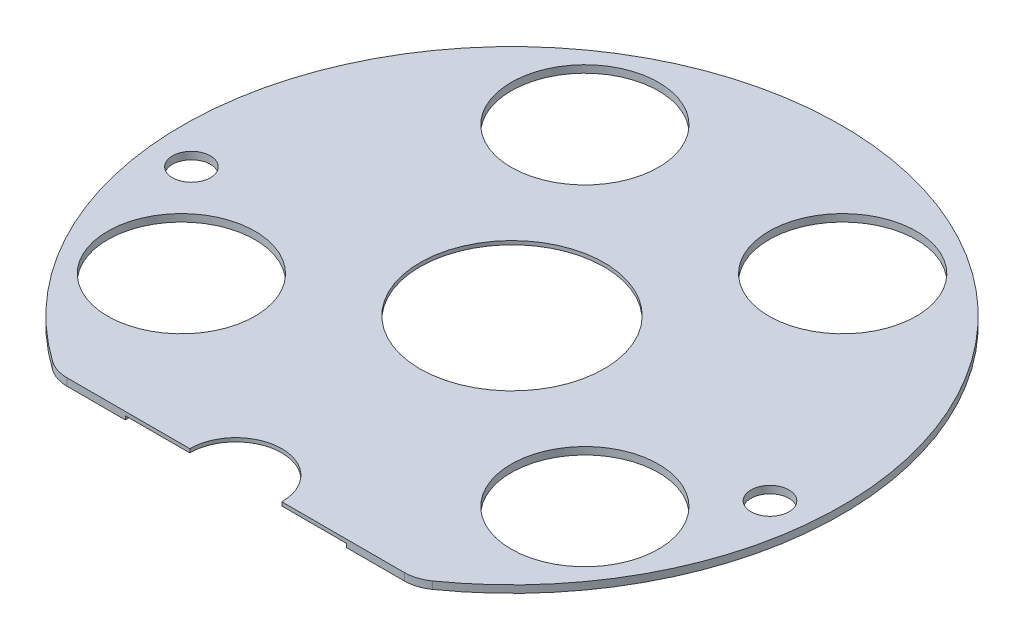
ISO-10303-21;
HEADER;
FILE_DESCRIPTION(('STEP AP214'),'2;1');
FILE_NAME('part.step','',(''),(''),'','','');
FILE_SCHEMA(('AUTOMOTIVE_DESIGN { 1 0 10303 214 1 1 1 1 }'));
ENDSEC;
DATA;
#1=APPLICATION_CONTEXT('core data for automotive mechanical design processes');
#2=APPLICATION_PROTOCOL_DEFINITION('international standard','automotive_design',2000,#1);
#3=PRODUCT_CONTEXT('',#1,'mechanical');
#4=PRODUCT('Part','Part','',(#3));
#5=PRODUCT_RELATED_PRODUCT_CATEGORY('part','',(#4));
#6=PRODUCT_DEFINITION_FORMATION('','',#4);
#7=PRODUCT_DEFINITION_CONTEXT('part definition',#1,'design');
#8=PRODUCT_DEFINITION('design','',#6,#7);
#9=PRODUCT_DEFINITION_SHAPE('','',#8);
#10=(LENGTH_UNIT() NAMED_UNIT(*) SI_UNIT(.MILLI.,.METRE.));
#11=(NAMED_UNIT(*) PLANE_ANGLE_UNIT() SI_UNIT($,.RADIAN.));
#12=(NAMED_UNIT(*) SI_UNIT($,.STERADIAN.) SOLID_ANGLE_UNIT());
#13=UNCERTAINTY_MEASURE_WITH_UNIT(LENGTH_MEASURE(1.E-05),#10,'distance_accuracy_value','');
#14=(GEOMETRIC_REPRESENTATION_CONTEXT(3) GLOBAL_UNCERTAINTY_ASSIGNED_CONTEXT((#13)) GLOBAL_UNIT_ASSIGNED_CONTEXT((#10,
#11,#12)) REPRESENTATION_CONTEXT('',''));
#15=CARTESIAN_POINT('',(0.,0.,0.));
#16=DIRECTION('',(0.,0.,1.));
#17=DIRECTION('',(1.,0.,0.));
#18=AXIS2_PLACEMENT_3D('',#15,#16,#17);
#19=CARTESIAN_POINT('',(-48.8390212842149,-2.,75.));
#20=DIRECTION('',(0.,0.,1.));
#21=DIRECTION('',(1.,0.,0.));
#22=AXIS2_PLACEMENT_3D('',#19,#20,#21);
#23=PLANE('',#22);
#24=DIRECTION('',(0.,1.,0.));
#25=VECTOR('',#24,1.);
#26=CARTESIAN_POINT('',(12.5,-20.,75.));
#27=LINE('',#26,#25);
#28=CARTESIAN_POINT('',(12.5,-1.,75.));
#29=VERTEX_POINT('',#28);
#30=CARTESIAN_POINT('',(12.5,0.,75.));
#31=VERTEX_POINT('',#30);
#32=EDGE_CURVE('E166',#29,#31,#27,.T.);
#33=ORIENTED_EDGE('',*,*,#32,.F.);
#34=DIRECTION('',(-1.,0.,0.));
#35=VECTOR('',#34,1.);
#36=CARTESIAN_POINT('',(-30.,-1.,75.));
#37=LINE('',#36,#35);
#38=CARTESIAN_POINT('',(30.,-1.,75.));
#39=VERTEX_POINT('',#38);
#40=EDGE_CURVE('E301',#39,#29,#37,.T.);
#41=ORIENTED_EDGE('',*,*,#40,.F.);
#42=DIRECTION('',(0.,-1.,0.));
#43=VECTOR('',#42,1.);
#44=CARTESIAN_POINT('',(30.,-1.,75.));
#45=LINE('',#44,#43);
#46=CARTESIAN_POINT('',(30.,-2.,75.));
#47=VERTEX_POINT('',#46);
#48=EDGE_CURVE('E316',#39,#47,#45,.T.);
#49=ORIENTED_EDGE('',*,*,#48,.T.);
#50=DIRECTION('',(1.,0.,0.));
#51=VECTOR('',#50,1.);
#52=CARTESIAN_POINT('',(-48.8390212842149,-2.,75.));
#53=LINE('',#52,#51);
#54=CARTESIAN_POINT('',(45.7739008606433,-2.,75.));
#55=VERTEX_POINT('',#54);
#56=EDGE_CURVE('E464',#47,#55,#53,.T.);
#57=ORIENTED_EDGE('',*,*,#56,.T.);
#58=DIRECTION('',(0.,1.,0.));
#59=VECTOR('',#58,1.);
#60=CARTESIAN_POINT('',(45.7739008606433,-2.,75.));
#61=LINE('',#60,#59);
#62=CARTESIAN_POINT('',(45.7739008606433,0.,75.));
#63=VERTEX_POINT('',#62);
#64=EDGE_CURVE('E190',#55,#63,#61,.T.);
#65=ORIENTED_EDGE('',*,*,#64,.T.);
#66=DIRECTION('',(1.,0.,0.));
#67=VECTOR('',#66,1.);
#68=CARTESIAN_POINT('',(-48.8390212842149,0.,75.));
#69=LINE('',#68,#67);
#70=EDGE_CURVE('E181',#31,#63,#69,.T.);
#71=ORIENTED_EDGE('',*,*,#70,.F.);
#72=EDGE_LOOP('',(#33,#41,#49,#57,#65,#71));
#73=FACE_BOUND('',#72,.T.);
#74=ADVANCED_FACE('F40',(#73),#23,.T.);
#75=CARTESIAN_POINT('',(0.,-2.00000000000001,0.));
#76=DIRECTION('',(0.,1.,0.));
#77=DIRECTION('',(0.,0.,1.));
#78=AXIS2_PLACEMENT_3D('',#75,#76,#77);
#79=CYLINDRICAL_SURFACE('',#78,25.);
#80=CARTESIAN_POINT('',(0.,0.,0.));
#81=DIRECTION('',(0.,1.,0.));
#82=DIRECTION('',(0.,0.,1.));
#83=AXIS2_PLACEMENT_3D('',#80,#81,#82);
#84=CIRCLE('',#83,25.);
#85=CARTESIAN_POINT('',(0.,0.,25.));
#86=VERTEX_POINT('',#85);
#87=EDGE_CURVE('E416',#86,#86,#84,.T.);
#88=ORIENTED_EDGE('',*,*,#87,.T.);
#89=EDGE_LOOP('',(#88));
#90=FACE_BOUND('',#89,.T.);
#91=CARTESIAN_POINT('',(0.,-1.,0.));
#92=DIRECTION('',(0.,-1.,0.));
#93=DIRECTION('',(0.,0.,-1.));
#94=AXIS2_PLACEMENT_3D('',#91,#92,#93);
#95=CIRCLE('',#94,25.);
#96=CARTESIAN_POINT('',(0.,-1.,-25.));
#97=VERTEX_POINT('',#96);
#98=EDGE_CURVE('E228',#97,#97,#95,.F.);
#99=ORIENTED_EDGE('',*,*,#98,.F.);
#100=EDGE_LOOP('',(#99));
#101=FACE_BOUND('',#100,.T.);
#102=ADVANCED_FACE('F263',(#90,#101),#79,.F.);
#103=CARTESIAN_POINT('',(0.,-2.,0.));
#104=DIRECTION('',(0.,1.,0.));
#105=DIRECTION('',(0.,0.,1.));
#106=AXIS2_PLACEMENT_3D('',#103,#104,#105);
#107=PLANE('',#106);
#108=DIRECTION('',(-1.,0.,0.));
#109=VECTOR('',#108,1.);
#110=CARTESIAN_POINT('',(66.05,-2.,-45.));
#111=LINE('',#110,#109);
#112=CARTESIAN_POINT('',(66.05,-2.,-45.));
#113=VERTEX_POINT('',#112);
#114=CARTESIAN_POINT('',(63.95,-2.,-45.));
#115=VERTEX_POINT('',#114);
#116=EDGE_CURVE('E380',#113,#115,#111,.T.);
#117=ORIENTED_EDGE('',*,*,#116,.T.);
#118=DIRECTION('',(0.,0.,1.));
#119=VECTOR('',#118,1.);
#120=CARTESIAN_POINT('',(63.95,-2.,-45.));
#121=LINE('',#120,#119);
#122=CARTESIAN_POINT('',(63.95,-2.,4.99999999999999));
#123=VERTEX_POINT('',#122);
#124=EDGE_CURVE('E398',#115,#123,#121,.T.);
#125=ORIENTED_EDGE('',*,*,#124,.T.);
#126=DIRECTION('',(-1.,0.,0.));
#127=VECTOR('',#126,1.);
#128=CARTESIAN_POINT('',(66.05,-2.,4.99999999999999));
#129=LINE('',#128,#127);
#130=CARTESIAN_POINT('',(66.05,-2.,4.99999999999999));
#131=VERTEX_POINT('',#130);
#132=EDGE_CURVE('E373',#131,#123,#129,.T.);
#133=ORIENTED_EDGE('',*,*,#132,.F.);
#134=DIRECTION('',(0.,0.,1.));
#135=VECTOR('',#134,1.);
#136=CARTESIAN_POINT('',(66.05,-2.,-45.));
#137=LINE('',#136,#135);
#138=EDGE_CURVE('E403',#113,#131,#137,.T.);
#139=ORIENTED_EDGE('',*,*,#138,.F.);
#140=EDGE_LOOP('',(#117,#125,#133,#139));
#141=FACE_BOUND('',#140,.T.);
#142=CARTESIAN_POINT('',(-35.,-2.00000000000001,-54.7722557505166));
#143=DIRECTION('',(0.,1.,0.));
#144=DIRECTION('',(0.,0.,1.));
#145=AXIS2_PLACEMENT_3D('',#142,#143,#144);
#146=CIRCLE('',#145,20.);
#147=CARTESIAN_POINT('',(-35.,-2.00000000000001,-34.7722557505166));
#148=VERTEX_POINT('',#147);
#149=EDGE_CURVE('E437',#148,#148,#146,.T.);
#150=ORIENTED_EDGE('',*,*,#149,.T.);
#151=EDGE_LOOP('',(#150));
#152=FACE_BOUND('',#151,.T.);
#153=CARTESIAN_POINT('',(35.,-2.00000000000001,-54.7722557505166));
#154=DIRECTION('',(0.,1.,0.));
#155=DIRECTION('',(0.,0.,1.));
#156=AXIS2_PLACEMENT_3D('',#153,#154,#155);
#157=CIRCLE('',#156,20.);
#158=CARTESIAN_POINT('',(35.,-2.00000000000001,-34.7722557505166));
#159=VERTEX_POINT('',#158);
#160=EDGE_CURVE('E429',#159,#159,#157,.T.);
#161=ORIENTED_EDGE('',*,*,#160,.T.);
#162=EDGE_LOOP('',(#161));
#163=FACE_BOUND('',#162,.T.);
#164=CARTESIAN_POINT('',(-54.7722557505166,-2.00000000000001,35.));
#165=DIRECTION('',(0.,1.,0.));
#166=DIRECTION('',(0.,0.,1.));
#167=AXIS2_PLACEMENT_3D('',#164,#165,#166);
#168=CIRCLE('',#167,20.);
#169=CARTESIAN_POINT('',(-54.7722557505166,-2.00000000000001,55.));
#170=VERTEX_POINT('',#169);
#171=EDGE_CURVE('E421',#170,#170,#168,.T.);
#172=ORIENTED_EDGE('',*,*,#171,.T.);
#173=EDGE_LOOP('',(#172));
#174=FACE_BOUND('',#173,.T.);
#175=CARTESIAN_POINT('',(54.7722557505166,-2.00000000000001,35.));
#176=DIRECTION('',(0.,1.,0.));
#177=DIRECTION('',(0.,0.,1.));
#178=AXIS2_PLACEMENT_3D('',#175,#176,#177);
#179=CIRCLE('',#178,20.);
#180=CARTESIAN_POINT('',(54.7722557505166,-2.00000000000001,55.));
#181=VERTEX_POINT('',#180);
#182=EDGE_CURVE('E412',#181,#181,#179,.T.);
#183=ORIENTED_EDGE('',*,*,#182,.T.);
#184=EDGE_LOOP('',(#183));
#185=FACE_BOUND('',#184,.T.);
#186=CARTESIAN_POINT('',(-78.5412092321762,-2.00000000000001,8.50167350275914));
#187=DIRECTION('',(0.,1.,0.));
#188=DIRECTION('',(0.,0.,1.));
#189=AXIS2_PLACEMENT_3D('',#186,#187,#188);
#190=CIRCLE('',#189,5.15);
#191=CARTESIAN_POINT('',(-78.5412092321762,-2.00000000000001,13.6516735027591));
#192=VERTEX_POINT('',#191);
#193=EDGE_CURVE('E198',#192,#192,#190,.T.);
#194=ORIENTED_EDGE('',*,*,#193,.T.);
#195=EDGE_LOOP('',(#194));
#196=FACE_BOUND('',#195,.T.);
#197=CARTESIAN_POINT('',(78.5412092321762,-2.00000000000001,8.50167350275912));
#198=DIRECTION('',(0.,1.,0.));
#199=DIRECTION('',(0.,0.,1.));
#200=AXIS2_PLACEMENT_3D('',#197,#198,#199);
#201=CIRCLE('',#200,5.15);
#202=CARTESIAN_POINT('',(78.5412092321762,-2.00000000000001,13.6516735027591));
#203=VERTEX_POINT('',#202);
#204=EDGE_CURVE('E447',#203,#203,#201,.T.);
#205=ORIENTED_EDGE('',*,*,#204,.T.);
#206=EDGE_LOOP('',(#205));
#207=FACE_BOUND('',#206,.T.);
#208=DIRECTION('',(1.,0.,0.));
#209=VECTOR('',#208,1.);
#210=CARTESIAN_POINT('',(-30.,-2.,-30.));
#211=LINE('',#210,#209);
#212=CARTESIAN_POINT('',(-30.,-2.,-30.));
#213=VERTEX_POINT('',#212);
#214=CARTESIAN_POINT('',(30.,-2.,-30.));
#215=VERTEX_POINT('',#214);
#216=EDGE_CURVE('E308',#213,#215,#211,.T.);
#217=ORIENTED_EDGE('',*,*,#216,.F.);
#218=DIRECTION('',(0.,0.,-1.));
#219=VECTOR('',#218,1.);
#220=CARTESIAN_POINT('',(-30.,-2.,75.));
#221=LINE('',#220,#219);
#222=CARTESIAN_POINT('',(-30.,-2.,75.));
#223=VERTEX_POINT('',#222);
#224=EDGE_CURVE('E175',#223,#213,#221,.T.);
#225=ORIENTED_EDGE('',*,*,#224,.F.);
#226=CARTESIAN_POINT('',(-45.7739008606433,-2.,75.));
#227=VERTEX_POINT('',#226);
#228=EDGE_CURVE('E205',#227,#223,#53,.T.);
#229=ORIENTED_EDGE('',*,*,#228,.F.);
#230=CARTESIAN_POINT('',(-45.7739008606433,-2.,65.));
#231=DIRECTION('',(0.,1.,0.));
#232=DIRECTION('',(0.,0.,1.));
#233=AXIS2_PLACEMENT_3D('',#230,#231,#232);
#234=CIRCLE('',#233,10.);
#235=CARTESIAN_POINT('',(-51.5316242393406,-2.,73.1761006289308));
#236=VERTEX_POINT('',#235);
#237=EDGE_CURVE('E221',#227,#236,#234,.F.);
#238=ORIENTED_EDGE('',*,*,#237,.T.);
#239=CARTESIAN_POINT('',(0.,-2.,0.));
#240=DIRECTION('',(0.,1.,0.));
#241=DIRECTION('',(0.,0.,1.));
#242=AXIS2_PLACEMENT_3D('',#239,#240,#241);
#243=CIRCLE('',#242,89.5);
#244=CARTESIAN_POINT('',(51.5316242393406,-2.,73.1761006289308));
#245=VERTEX_POINT('',#244);
#246=EDGE_CURVE('E196',#245,#236,#243,.T.);
#247=ORIENTED_EDGE('',*,*,#246,.F.);
#248=CARTESIAN_POINT('',(45.7739008606433,-2.,65.));
#249=DIRECTION('',(0.,1.,0.));
#250=DIRECTION('',(0.,0.,1.));
#251=AXIS2_PLACEMENT_3D('',#248,#249,#250);
#252=CIRCLE('',#251,10.);
#253=EDGE_CURVE('E224',#245,#55,#252,.F.);
#254=ORIENTED_EDGE('',*,*,#253,.T.);
#255=ORIENTED_EDGE('',*,*,#56,.F.);
#256=DIRECTION('',(0.,0.,1.));
#257=VECTOR('',#256,1.);
#258=CARTESIAN_POINT('',(30.,-2.,75.));
#259=LINE('',#258,#257);
#260=EDGE_CURVE('E296',#215,#47,#259,.T.);
#261=ORIENTED_EDGE('',*,*,#260,.F.);
#262=EDGE_LOOP('',(#217,#225,#229,#238,#247,#254,#255,#261));
#263=FACE_BOUND('',#262,.T.);
#264=DIRECTION('',(1.,0.,0.));
#265=VECTOR('',#264,1.);
#266=CARTESIAN_POINT('',(-66.05,-2.,-45.));
#267=LINE('',#266,#265);
#268=CARTESIAN_POINT('',(-66.05,-2.,-45.));
#269=VERTEX_POINT('',#268);
#270=CARTESIAN_POINT('',(-63.95,-2.,-45.));
#271=VERTEX_POINT('',#270);
#272=EDGE_CURVE('E329',#269,#271,#267,.T.);
#273=ORIENTED_EDGE('',*,*,#272,.F.);
#274=DIRECTION('',(0.,0.,1.));
#275=VECTOR('',#274,1.);
#276=CARTESIAN_POINT('',(-66.05,-2.,-45.));
#277=LINE('',#276,#275);
#278=CARTESIAN_POINT('',(-66.05,-2.,4.99999999999999));
#279=VERTEX_POINT('',#278);
#280=EDGE_CURVE('E361',#269,#279,#277,.T.);
#281=ORIENTED_EDGE('',*,*,#280,.T.);
#282=DIRECTION('',(1.,0.,0.));
#283=VECTOR('',#282,1.);
#284=CARTESIAN_POINT('',(-66.05,-2.,4.99999999999999));
#285=LINE('',#284,#283);
#286=CARTESIAN_POINT('',(-63.95,-2.,4.99999999999999));
#287=VERTEX_POINT('',#286);
#288=EDGE_CURVE('E343',#279,#287,#285,.T.);
#289=ORIENTED_EDGE('',*,*,#288,.T.);
#290=DIRECTION('',(0.,0.,1.));
#291=VECTOR('',#290,1.);
#292=CARTESIAN_POINT('',(-63.95,-2.,-45.));
#293=LINE('',#292,#291);
#294=EDGE_CURVE('E339',#271,#287,#293,.T.);
#295=ORIENTED_EDGE('',*,*,#294,.F.);
#296=EDGE_LOOP('',(#273,#281,#289,#295));
#297=FACE_BOUND('',#296,.T.);
#298=ADVANCED_FACE('F269',(#141,#152,#163,#174,#185,#196,#207,#263,#297),#107,.F.);
#299=CARTESIAN_POINT('',(0.,-2.,0.));
#300=DIRECTION('',(0.,1.,0.));
#301=DIRECTION('',(0.,0.,1.));
#302=AXIS2_PLACEMENT_3D('',#299,#300,#301);
#303=CYLINDRICAL_SURFACE('',#302,89.5);
#304=CARTESIAN_POINT('',(0.,0.,0.));
#305=DIRECTION('',(0.,1.,0.));
#306=DIRECTION('',(0.,0.,1.));
#307=AXIS2_PLACEMENT_3D('',#304,#305,#306);
#308=CIRCLE('',#307,89.5);
#309=CARTESIAN_POINT('',(51.5316242393406,0.,73.1761006289308));
#310=VERTEX_POINT('',#309);
#311=CARTESIAN_POINT('',(-51.5316242393406,0.,73.1761006289308));
#312=VERTEX_POINT('',#311);
#313=EDGE_CURVE('E192',#310,#312,#308,.T.);
#314=ORIENTED_EDGE('',*,*,#313,.F.);
#315=DIRECTION('',(0.,1.,0.));
#316=VECTOR('',#315,1.);
#317=CARTESIAN_POINT('',(51.5316242393405,-2.,73.1761006289308));
#318=LINE('',#317,#316);
#319=EDGE_CURVE('E218',#310,#245,#318,.F.);
#320=ORIENTED_EDGE('',*,*,#319,.T.);
#321=ORIENTED_EDGE('',*,*,#246,.T.);
#322=DIRECTION('',(0.,1.,0.));
#323=VECTOR('',#322,1.);
#324=CARTESIAN_POINT('',(-51.5316242393405,-2.,73.1761006289308));
#325=LINE('',#324,#323);
#326=EDGE_CURVE('E214',#236,#312,#325,.T.);
#327=ORIENTED_EDGE('',*,*,#326,.T.);
#328=EDGE_LOOP('',(#314,#320,#321,#327));
#329=FACE_BOUND('',#328,.T.);
#330=ADVANCED_FACE('F275',(#329),#303,.T.);
#331=DIRECTION('',(0.,1.,0.));
#332=VECTOR('',#331,1.);
#333=CARTESIAN_POINT('',(-12.5,-20.,75.));
#334=LINE('',#333,#332);
#335=CARTESIAN_POINT('',(-12.5,0.,75.));
#336=VERTEX_POINT('',#335);
#337=CARTESIAN_POINT('',(-12.5,-1.,75.));
#338=VERTEX_POINT('',#337);
#339=EDGE_CURVE('E56',#336,#338,#334,.F.);
#340=ORIENTED_EDGE('',*,*,#339,.F.);
#341=CARTESIAN_POINT('',(-45.7739008606433,0.,75.));
#342=VERTEX_POINT('',#341);
#343=EDGE_CURVE('E184',#342,#336,#69,.T.);
#344=ORIENTED_EDGE('',*,*,#343,.F.);
#345=DIRECTION('',(0.,1.,0.));
#346=VECTOR('',#345,1.);
#347=CARTESIAN_POINT('',(-45.7739008606433,-2.,75.));
#348=LINE('',#347,#346);
#349=EDGE_CURVE('E202',#342,#227,#348,.F.);
#350=ORIENTED_EDGE('',*,*,#349,.T.);
#351=ORIENTED_EDGE('',*,*,#228,.T.);
#352=DIRECTION('',(0.,-1.,0.));
#353=VECTOR('',#352,1.);
#354=CARTESIAN_POINT('',(-30.,-1.,75.));
#355=LINE('',#354,#353);
#356=CARTESIAN_POINT('',(-30.,-1.,75.));
#357=VERTEX_POINT('',#356);
#358=EDGE_CURVE('E233',#357,#223,#355,.T.);
#359=ORIENTED_EDGE('',*,*,#358,.F.);
#360=EDGE_CURVE('E286',#338,#357,#37,.T.);
#361=ORIENTED_EDGE('',*,*,#360,.F.);
#362=EDGE_LOOP('',(#340,#344,#350,#351,#359,#361));
#363=FACE_BOUND('',#362,.T.);
#364=ADVANCED_FACE('F265',(#363),#23,.T.);
#365=CARTESIAN_POINT('',(0.,0.,0.));
#366=DIRECTION('',(0.,1.,0.));
#367=DIRECTION('',(0.,0.,1.));
#368=AXIS2_PLACEMENT_3D('',#365,#366,#367);
#369=PLANE('',#368);
#370=CARTESIAN_POINT('',(0.,0.,75.));
#371=DIRECTION('',(0.,1.,0.));
#372=DIRECTION('',(0.,0.,1.));
#373=AXIS2_PLACEMENT_3D('',#370,#371,#372);
#374=CIRCLE('',#373,12.5);
#375=EDGE_CURVE('E169',#31,#336,#374,.T.);
#376=ORIENTED_EDGE('',*,*,#375,.F.);
#377=ORIENTED_EDGE('',*,*,#70,.T.);
#378=CARTESIAN_POINT('',(45.7739008606433,0.,65.));
#379=DIRECTION('',(0.,1.,0.));
#380=DIRECTION('',(0.,0.,1.));
#381=AXIS2_PLACEMENT_3D('',#378,#379,#380);
#382=CIRCLE('',#381,10.);
#383=EDGE_CURVE('E211',#63,#310,#382,.T.);
#384=ORIENTED_EDGE('',*,*,#383,.T.);
#385=ORIENTED_EDGE('',*,*,#313,.T.);
#386=CARTESIAN_POINT('',(-45.7739008606433,0.,65.));
#387=DIRECTION('',(0.,1.,0.));
#388=DIRECTION('',(0.,0.,1.));
#389=AXIS2_PLACEMENT_3D('',#386,#387,#388);
#390=CIRCLE('',#389,10.);
#391=EDGE_CURVE('E208',#312,#342,#390,.T.);
#392=ORIENTED_EDGE('',*,*,#391,.T.);
#393=ORIENTED_EDGE('',*,*,#343,.T.);
#394=EDGE_LOOP('',(#376,#377,#384,#385,#392,#393));
#395=FACE_BOUND('',#394,.T.);
#396=CARTESIAN_POINT('',(-35.,0.,-54.7722557505166));
#397=DIRECTION('',(0.,1.,0.));
#398=DIRECTION('',(0.,0.,1.));
#399=AXIS2_PLACEMENT_3D('',#396,#397,#398);
#400=CIRCLE('',#399,20.);
#401=CARTESIAN_POINT('',(-35.,0.,-34.7722557505166));
#402=VERTEX_POINT('',#401);
#403=EDGE_CURVE('E402',#402,#402,#400,.T.);
#404=ORIENTED_EDGE('',*,*,#403,.F.);
#405=EDGE_LOOP('',(#404));
#406=FACE_BOUND('',#405,.T.);
#407=CARTESIAN_POINT('',(35.,0.,-54.7722557505166));
#408=DIRECTION('',(0.,1.,0.));
#409=DIRECTION('',(0.,0.,1.));
#410=AXIS2_PLACEMENT_3D('',#407,#408,#409);
#411=CIRCLE('',#410,20.);
#412=CARTESIAN_POINT('',(35.,0.,-34.7722557505166));
#413=VERTEX_POINT('',#412);
#414=EDGE_CURVE('E433',#413,#413,#411,.T.);
#415=ORIENTED_EDGE('',*,*,#414,.F.);
#416=EDGE_LOOP('',(#415));
#417=FACE_BOUND('',#416,.T.);
#418=CARTESIAN_POINT('',(-54.7722557505166,0.,35.));
#419=DIRECTION('',(0.,1.,0.));
#420=DIRECTION('',(0.,0.,1.));
#421=AXIS2_PLACEMENT_3D('',#418,#419,#420);
#422=CIRCLE('',#421,20.);
#423=CARTESIAN_POINT('',(-54.7722557505166,0.,55.));
#424=VERTEX_POINT('',#423);
#425=EDGE_CURVE('E425',#424,#424,#422,.T.);
#426=ORIENTED_EDGE('',*,*,#425,.F.);
#427=EDGE_LOOP('',(#426));
#428=FACE_BOUND('',#427,.T.);
#429=CARTESIAN_POINT('',(54.7722557505166,0.,35.));
#430=DIRECTION('',(0.,1.,0.));
#431=DIRECTION('',(0.,0.,1.));
#432=AXIS2_PLACEMENT_3D('',#429,#430,#431);
#433=CIRCLE('',#432,20.);
#434=CARTESIAN_POINT('',(54.7722557505166,0.,55.));
#435=VERTEX_POINT('',#434);
#436=EDGE_CURVE('E417',#435,#435,#433,.T.);
#437=ORIENTED_EDGE('',*,*,#436,.F.);
#438=EDGE_LOOP('',(#437));
#439=FACE_BOUND('',#438,.T.);
#440=ORIENTED_EDGE('',*,*,#87,.F.);
#441=EDGE_LOOP('',(#440));
#442=FACE_BOUND('',#441,.T.);
#443=CARTESIAN_POINT('',(-78.5412092321762,0.,8.50167350275914));
#444=DIRECTION('',(0.,1.,0.));
#445=DIRECTION('',(0.,0.,1.));
#446=AXIS2_PLACEMENT_3D('',#443,#444,#445);
#447=CIRCLE('',#446,5.15);
#448=CARTESIAN_POINT('',(-78.5412092321762,0.,13.6516735027591));
#449=VERTEX_POINT('',#448);
#450=EDGE_CURVE('E451',#449,#449,#447,.T.);
#451=ORIENTED_EDGE('',*,*,#450,.F.);
#452=EDGE_LOOP('',(#451));
#453=FACE_BOUND('',#452,.T.);
#454=CARTESIAN_POINT('',(78.5412092321762,0.,8.50167350275912));
#455=DIRECTION('',(0.,1.,0.));
#456=DIRECTION('',(0.,0.,1.));
#457=AXIS2_PLACEMENT_3D('',#454,#455,#456);
#458=CIRCLE('',#457,5.15);
#459=CARTESIAN_POINT('',(78.5412092321762,0.,13.6516735027591));
#460=VERTEX_POINT('',#459);
#461=EDGE_CURVE('E455',#460,#460,#458,.T.);
#462=ORIENTED_EDGE('',*,*,#461,.F.);
#463=EDGE_LOOP('',(#462));
#464=FACE_BOUND('',#463,.T.);
#465=ADVANCED_FACE('F179',(#395,#406,#417,#428,#439,#442,#453,#464),#369,.T.);
#466=CARTESIAN_POINT('',(78.5412092321762,-2.00000000000001,8.50167350275912));
#467=DIRECTION('',(0.,1.,0.));
#468=DIRECTION('',(0.,0.,1.));
#469=AXIS2_PLACEMENT_3D('',#466,#467,#468);
#470=CYLINDRICAL_SURFACE('',#469,5.15);
#471=ORIENTED_EDGE('',*,*,#204,.F.);
#472=EDGE_LOOP('',(#471));
#473=FACE_BOUND('',#472,.T.);
#474=ORIENTED_EDGE('',*,*,#461,.T.);
#475=EDGE_LOOP('',(#474));
#476=FACE_BOUND('',#475,.T.);
#477=ADVANCED_FACE('F281',(#473,#476),#470,.F.);
#478=CARTESIAN_POINT('',(-78.5412092321762,-2.00000000000001,8.50167350275914));
#479=DIRECTION('',(0.,1.,0.));
#480=DIRECTION('',(0.,0.,1.));
#481=AXIS2_PLACEMENT_3D('',#478,#479,#480);
#482=CYLINDRICAL_SURFACE('',#481,5.15);
#483=ORIENTED_EDGE('',*,*,#193,.F.);
#484=EDGE_LOOP('',(#483));
#485=FACE_BOUND('',#484,.T.);
#486=ORIENTED_EDGE('',*,*,#450,.T.);
#487=EDGE_LOOP('',(#486));
#488=FACE_BOUND('',#487,.T.);
#489=ADVANCED_FACE('F551',(#485,#488),#482,.F.);
#490=CARTESIAN_POINT('',(54.7722557505166,-2.00000000000001,35.));
#491=DIRECTION('',(0.,1.,0.));
#492=DIRECTION('',(0.,0.,1.));
#493=AXIS2_PLACEMENT_3D('',#490,#491,#492);
#494=CYLINDRICAL_SURFACE('',#493,20.);
#495=ORIENTED_EDGE('',*,*,#182,.F.);
#496=EDGE_LOOP('',(#495));
#497=FACE_BOUND('',#496,.T.);
#498=ORIENTED_EDGE('',*,*,#436,.T.);
#499=EDGE_LOOP('',(#498));
#500=FACE_BOUND('',#499,.T.);
#501=ADVANCED_FACE('F547',(#497,#500),#494,.F.);
#502=CARTESIAN_POINT('',(-54.7722557505166,-2.00000000000001,35.));
#503=DIRECTION('',(0.,1.,0.));
#504=DIRECTION('',(0.,0.,1.));
#505=AXIS2_PLACEMENT_3D('',#502,#503,#504);
#506=CYLINDRICAL_SURFACE('',#505,20.);
#507=ORIENTED_EDGE('',*,*,#171,.F.);
#508=EDGE_LOOP('',(#507));
#509=FACE_BOUND('',#508,.T.);
#510=ORIENTED_EDGE('',*,*,#425,.T.);
#511=EDGE_LOOP('',(#510));
#512=FACE_BOUND('',#511,.T.);
#513=ADVANCED_FACE('F550',(#509,#512),#506,.F.);
#514=CARTESIAN_POINT('',(35.,-2.00000000000001,-54.7722557505166));
#515=DIRECTION('',(0.,1.,0.));
#516=DIRECTION('',(0.,0.,1.));
#517=AXIS2_PLACEMENT_3D('',#514,#515,#516);
#518=CYLINDRICAL_SURFACE('',#517,20.);
#519=ORIENTED_EDGE('',*,*,#160,.F.);
#520=EDGE_LOOP('',(#519));
#521=FACE_BOUND('',#520,.T.);
#522=ORIENTED_EDGE('',*,*,#414,.T.);
#523=EDGE_LOOP('',(#522));
#524=FACE_BOUND('',#523,.T.);
#525=ADVANCED_FACE('F555',(#521,#524),#518,.F.);
#526=CARTESIAN_POINT('',(-35.,-2.00000000000001,-54.7722557505166));
#527=DIRECTION('',(0.,1.,0.));
#528=DIRECTION('',(0.,0.,1.));
#529=AXIS2_PLACEMENT_3D('',#526,#527,#528);
#530=CYLINDRICAL_SURFACE('',#529,20.);
#531=ORIENTED_EDGE('',*,*,#149,.F.);
#532=EDGE_LOOP('',(#531));
#533=FACE_BOUND('',#532,.T.);
#534=ORIENTED_EDGE('',*,*,#403,.T.);
#535=EDGE_LOOP('',(#534));
#536=FACE_BOUND('',#535,.T.);
#537=ADVANCED_FACE('F559',(#533,#536),#530,.F.);
#538=CARTESIAN_POINT('',(45.7739008606433,-2.,65.));
#539=DIRECTION('',(0.,1.,0.));
#540=DIRECTION('',(0.,0.,1.));
#541=AXIS2_PLACEMENT_3D('',#538,#539,#540);
#542=CYLINDRICAL_SURFACE('',#541,10.);
#543=ORIENTED_EDGE('',*,*,#253,.F.);
#544=ORIENTED_EDGE('',*,*,#319,.F.);
#545=ORIENTED_EDGE('',*,*,#383,.F.);
#546=ORIENTED_EDGE('',*,*,#64,.F.);
#547=EDGE_LOOP('',(#543,#544,#545,#546));
#548=FACE_BOUND('',#547,.T.);
#549=ADVANCED_FACE('F478',(#548),#542,.T.);
#550=CARTESIAN_POINT('',(-45.7739008606433,-2.,65.));
#551=DIRECTION('',(0.,1.,0.));
#552=DIRECTION('',(0.,0.,1.));
#553=AXIS2_PLACEMENT_3D('',#550,#551,#552);
#554=CYLINDRICAL_SURFACE('',#553,10.);
#555=ORIENTED_EDGE('',*,*,#237,.F.);
#556=ORIENTED_EDGE('',*,*,#349,.F.);
#557=ORIENTED_EDGE('',*,*,#391,.F.);
#558=ORIENTED_EDGE('',*,*,#326,.F.);
#559=EDGE_LOOP('',(#555,#556,#557,#558));
#560=FACE_BOUND('',#559,.T.);
#561=ADVANCED_FACE('F483',(#560),#554,.T.);
#562=CARTESIAN_POINT('',(63.95,-2.,-45.));
#563=DIRECTION('',(-0.866025403784435,0.500000000000006,0.));
#564=DIRECTION('',(-0.500000000000006,-0.866025403784435,0.));
#565=AXIS2_PLACEMENT_3D('',#562,#563,#564);
#566=PLANE('',#565);
#567=DIRECTION('',(-0.500000000000006,-0.866025403784435,0.));
#568=VECTOR('',#567,1.);
#569=CARTESIAN_POINT('',(63.95,-2.,4.99999999999999));
#570=LINE('',#569,#568);
#571=CARTESIAN_POINT('',(63.112842109675,-3.45,4.99999999999999));
#572=VERTEX_POINT('',#571);
#573=EDGE_CURVE('E356',#123,#572,#570,.T.);
#574=ORIENTED_EDGE('',*,*,#573,.F.);
#575=ORIENTED_EDGE('',*,*,#124,.F.);
#576=DIRECTION('',(-0.500000000000006,-0.866025403784435,0.));
#577=VECTOR('',#576,1.);
#578=CARTESIAN_POINT('',(63.95,-2.,-45.));
#579=LINE('',#578,#577);
#580=CARTESIAN_POINT('',(63.112842109675,-3.45,-45.));
#581=VERTEX_POINT('',#580);
#582=EDGE_CURVE('E368',#115,#581,#579,.T.);
#583=ORIENTED_EDGE('',*,*,#582,.T.);
#584=DIRECTION('',(0.,0.,1.));
#585=VECTOR('',#584,1.);
#586=CARTESIAN_POINT('',(63.112842109675,-3.45,-45.));
#587=LINE('',#586,#585);
#588=EDGE_CURVE('E384',#581,#572,#587,.T.);
#589=ORIENTED_EDGE('',*,*,#588,.T.);
#590=EDGE_LOOP('',(#574,#575,#583,#589));
#591=FACE_BOUND('',#590,.T.);
#592=ADVANCED_FACE('F539',(#591),#566,.T.);
#593=CARTESIAN_POINT('',(66.887157890325,-3.45,-45.));
#594=DIRECTION('',(0.866025403784435,0.500000000000006,0.));
#595=DIRECTION('',(-0.500000000000006,0.866025403784435,0.));
#596=AXIS2_PLACEMENT_3D('',#593,#594,#595);
#597=PLANE('',#596);
#598=DIRECTION('',(-0.500000000000006,0.866025403784435,0.));
#599=VECTOR('',#598,1.);
#600=CARTESIAN_POINT('',(66.887157890325,-3.45,4.99999999999999));
#601=LINE('',#600,#599);
#602=CARTESIAN_POINT('',(66.887157890325,-3.45,4.99999999999999));
#603=VERTEX_POINT('',#602);
#604=EDGE_CURVE('E392',#603,#131,#601,.T.);
#605=ORIENTED_EDGE('',*,*,#604,.F.);
#606=DIRECTION('',(0.,0.,1.));
#607=VECTOR('',#606,1.);
#608=CARTESIAN_POINT('',(66.887157890325,-3.45,-45.));
#609=LINE('',#608,#607);
#610=CARTESIAN_POINT('',(66.887157890325,-3.45,-45.));
#611=VERTEX_POINT('',#610);
#612=EDGE_CURVE('E407',#611,#603,#609,.T.);
#613=ORIENTED_EDGE('',*,*,#612,.F.);
#614=DIRECTION('',(-0.500000000000006,0.866025403784435,0.));
#615=VECTOR('',#614,1.);
#616=CARTESIAN_POINT('',(66.887157890325,-3.45,-45.));
#617=LINE('',#616,#615);
#618=EDGE_CURVE('E377',#611,#113,#617,.T.);
#619=ORIENTED_EDGE('',*,*,#618,.T.);
#620=ORIENTED_EDGE('',*,*,#138,.T.);
#621=EDGE_LOOP('',(#605,#613,#619,#620));
#622=FACE_BOUND('',#621,.T.);
#623=ADVANCED_FACE('F536',(#622),#597,.T.);
#624=CARTESIAN_POINT('',(63.112842109675,-3.45,-45.));
#625=DIRECTION('',(0.,-1.,0.));
#626=DIRECTION('',(0.,0.,-1.));
#627=AXIS2_PLACEMENT_3D('',#624,#625,#626);
#628=PLANE('',#627);
#629=DIRECTION('',(1.,0.,0.));
#630=VECTOR('',#629,1.);
#631=CARTESIAN_POINT('',(63.112842109675,-3.45,4.99999999999999));
#632=LINE('',#631,#630);
#633=EDGE_CURVE('E388',#572,#603,#632,.T.);
#634=ORIENTED_EDGE('',*,*,#633,.F.);
#635=ORIENTED_EDGE('',*,*,#588,.F.);
#636=DIRECTION('',(1.,0.,0.));
#637=VECTOR('',#636,1.);
#638=CARTESIAN_POINT('',(63.112842109675,-3.45,-45.));
#639=LINE('',#638,#637);
#640=EDGE_CURVE('E372',#581,#611,#639,.T.);
#641=ORIENTED_EDGE('',*,*,#640,.T.);
#642=ORIENTED_EDGE('',*,*,#612,.T.);
#643=EDGE_LOOP('',(#634,#635,#641,#642));
#644=FACE_BOUND('',#643,.T.);
#645=ADVANCED_FACE('F531',(#644),#628,.T.);
#646=CARTESIAN_POINT('',(0.,0.,-45.));
#647=DIRECTION('',(0.,0.,1.));
#648=DIRECTION('',(1.,0.,0.));
#649=AXIS2_PLACEMENT_3D('',#646,#647,#648);
#650=PLANE('',#649);
#651=ORIENTED_EDGE('',*,*,#582,.F.);
#652=ORIENTED_EDGE('',*,*,#116,.F.);
#653=ORIENTED_EDGE('',*,*,#618,.F.);
#654=ORIENTED_EDGE('',*,*,#640,.F.);
#655=EDGE_LOOP('',(#651,#652,#653,#654));
#656=FACE_BOUND('',#655,.T.);
#657=ADVANCED_FACE('F528',(#656),#650,.F.);
#658=CARTESIAN_POINT('',(0.,0.,4.99999999999999));
#659=DIRECTION('',(0.,0.,1.));
#660=DIRECTION('',(1.,0.,0.));
#661=AXIS2_PLACEMENT_3D('',#658,#659,#660);
#662=PLANE('',#661);
#663=ORIENTED_EDGE('',*,*,#573,.T.);
#664=ORIENTED_EDGE('',*,*,#633,.T.);
#665=ORIENTED_EDGE('',*,*,#604,.T.);
#666=ORIENTED_EDGE('',*,*,#132,.T.);
#667=EDGE_LOOP('',(#663,#664,#665,#666));
#668=FACE_BOUND('',#667,.T.);
#669=ADVANCED_FACE('F526',(#668),#662,.T.);
#670=CARTESIAN_POINT('',(-63.95,-2.,-45.));
#671=DIRECTION('',(-0.866025403784435,-0.500000000000006,0.));
#672=DIRECTION('',(0.500000000000006,-0.866025403784435,0.));
#673=AXIS2_PLACEMENT_3D('',#670,#671,#672);
#674=PLANE('',#673);
#675=DIRECTION('',(0.500000000000006,-0.866025403784435,0.));
#676=VECTOR('',#675,1.);
#677=CARTESIAN_POINT('',(-63.95,-2.,4.99999999999999));
#678=LINE('',#677,#676);
#679=CARTESIAN_POINT('',(-63.112842109675,-3.45,4.99999999999999));
#680=VERTEX_POINT('',#679);
#681=EDGE_CURVE('E232',#287,#680,#678,.T.);
#682=ORIENTED_EDGE('',*,*,#681,.T.);
#683=DIRECTION('',(0.,0.,1.));
#684=VECTOR('',#683,1.);
#685=CARTESIAN_POINT('',(-63.112842109675,-3.45,-45.));
#686=LINE('',#685,#684);
#687=CARTESIAN_POINT('',(-63.112842109675,-3.45,-45.));
#688=VERTEX_POINT('',#687);
#689=EDGE_CURVE('E352',#688,#680,#686,.T.);
#690=ORIENTED_EDGE('',*,*,#689,.F.);
#691=DIRECTION('',(0.500000000000006,-0.866025403784435,0.));
#692=VECTOR('',#691,1.);
#693=CARTESIAN_POINT('',(-63.95,-2.,-45.));
#694=LINE('',#693,#692);
#695=EDGE_CURVE('E325',#271,#688,#694,.T.);
#696=ORIENTED_EDGE('',*,*,#695,.F.);
#697=ORIENTED_EDGE('',*,*,#294,.T.);
#698=EDGE_LOOP('',(#682,#690,#696,#697));
#699=FACE_BOUND('',#698,.T.);
#700=ADVANCED_FACE('F519',(#699),#674,.F.);
#701=CARTESIAN_POINT('',(-63.112842109675,-3.45,-45.));
#702=DIRECTION('',(0.,1.,0.));
#703=DIRECTION('',(0.,0.,1.));
#704=AXIS2_PLACEMENT_3D('',#701,#702,#703);
#705=PLANE('',#704);
#706=DIRECTION('',(-1.,0.,0.));
#707=VECTOR('',#706,1.);
#708=CARTESIAN_POINT('',(-63.112842109675,-3.45,4.99999999999999));
#709=LINE('',#708,#707);
#710=CARTESIAN_POINT('',(-66.887157890325,-3.45,4.99999999999999));
#711=VERTEX_POINT('',#710);
#712=EDGE_CURVE('E330',#680,#711,#709,.T.);
#713=ORIENTED_EDGE('',*,*,#712,.T.);
#714=DIRECTION('',(0.,0.,1.));
#715=VECTOR('',#714,1.);
#716=CARTESIAN_POINT('',(-66.887157890325,-3.45,-45.));
#717=LINE('',#716,#715);
#718=CARTESIAN_POINT('',(-66.887157890325,-3.45,-45.));
#719=VERTEX_POINT('',#718);
#720=EDGE_CURVE('E357',#719,#711,#717,.T.);
#721=ORIENTED_EDGE('',*,*,#720,.F.);
#722=DIRECTION('',(-1.,0.,0.));
#723=VECTOR('',#722,1.);
#724=CARTESIAN_POINT('',(-63.112842109675,-3.45,-45.));
#725=LINE('',#724,#723);
#726=EDGE_CURVE('E336',#688,#719,#725,.T.);
#727=ORIENTED_EDGE('',*,*,#726,.F.);
#728=ORIENTED_EDGE('',*,*,#689,.T.);
#729=EDGE_LOOP('',(#713,#721,#727,#728));
#730=FACE_BOUND('',#729,.T.);
#731=ADVANCED_FACE('F516',(#730),#705,.F.);
#732=CARTESIAN_POINT('',(-66.887157890325,-3.45,-45.));
#733=DIRECTION('',(0.866025403784435,-0.500000000000006,0.));
#734=DIRECTION('',(0.500000000000006,0.866025403784435,0.));
#735=AXIS2_PLACEMENT_3D('',#732,#733,#734);
#736=PLANE('',#735);
#737=DIRECTION('',(0.500000000000006,0.866025403784435,0.));
#738=VECTOR('',#737,1.);
#739=CARTESIAN_POINT('',(-66.887157890325,-3.45,4.99999999999999));
#740=LINE('',#739,#738);
#741=EDGE_CURVE('E347',#711,#279,#740,.T.);
#742=ORIENTED_EDGE('',*,*,#741,.T.);
#743=ORIENTED_EDGE('',*,*,#280,.F.);
#744=DIRECTION('',(0.500000000000006,0.866025403784435,0.));
#745=VECTOR('',#744,1.);
#746=CARTESIAN_POINT('',(-66.887157890325,-3.45,-45.));
#747=LINE('',#746,#745);
#748=EDGE_CURVE('E333',#719,#269,#747,.T.);
#749=ORIENTED_EDGE('',*,*,#748,.F.);
#750=ORIENTED_EDGE('',*,*,#720,.T.);
#751=EDGE_LOOP('',(#742,#743,#749,#750));
#752=FACE_BOUND('',#751,.T.);
#753=ADVANCED_FACE('F511',(#752),#736,.F.);
#754=CARTESIAN_POINT('',(0.,0.,-45.));
#755=DIRECTION('',(0.,0.,1.));
#756=DIRECTION('',(-1.,0.,0.));
#757=AXIS2_PLACEMENT_3D('',#754,#755,#756);
#758=PLANE('',#757);
#759=ORIENTED_EDGE('',*,*,#695,.T.);
#760=ORIENTED_EDGE('',*,*,#726,.T.);
#761=ORIENTED_EDGE('',*,*,#748,.T.);
#762=ORIENTED_EDGE('',*,*,#272,.T.);
#763=EDGE_LOOP('',(#759,#760,#761,#762));
#764=FACE_BOUND('',#763,.T.);
#765=ADVANCED_FACE('F507',(#764),#758,.F.);
#766=CARTESIAN_POINT('',(0.,0.,4.99999999999999));
#767=DIRECTION('',(0.,0.,1.));
#768=DIRECTION('',(-1.,0.,0.));
#769=AXIS2_PLACEMENT_3D('',#766,#767,#768);
#770=PLANE('',#769);
#771=ORIENTED_EDGE('',*,*,#681,.F.);
#772=ORIENTED_EDGE('',*,*,#288,.F.);
#773=ORIENTED_EDGE('',*,*,#741,.F.);
#774=ORIENTED_EDGE('',*,*,#712,.F.);
#775=EDGE_LOOP('',(#771,#772,#773,#774));
#776=FACE_BOUND('',#775,.T.);
#777=ADVANCED_FACE('F510',(#776),#770,.T.);
#778=CARTESIAN_POINT('',(0.,-1.,0.));
#779=DIRECTION('',(0.,-1.,0.));
#780=DIRECTION('',(0.,0.,-1.));
#781=AXIS2_PLACEMENT_3D('',#778,#779,#780);
#782=PLANE('',#781);
#783=CARTESIAN_POINT('',(20.,-1.,72.05));
#784=DIRECTION('',(0.,-1.,0.));
#785=DIRECTION('',(0.,0.,-1.));
#786=AXIS2_PLACEMENT_3D('',#783,#784,#785);
#787=CIRCLE('',#786,0.750000000000002);
#788=CARTESIAN_POINT('',(20.,-1.,71.3));
#789=VERTEX_POINT('',#788);
#790=EDGE_CURVE('E236',#789,#789,#787,.T.);
#791=ORIENTED_EDGE('',*,*,#790,.F.);
#792=EDGE_LOOP('',(#791));
#793=FACE_BOUND('',#792,.T.);
#794=CARTESIAN_POINT('',(-20.,-1.,72.05));
#795=DIRECTION('',(0.,-1.,0.));
#796=DIRECTION('',(0.,0.,-1.));
#797=AXIS2_PLACEMENT_3D('',#794,#795,#796);
#798=CIRCLE('',#797,0.750000000000002);
#799=CARTESIAN_POINT('',(-20.,-1.,71.3));
#800=VERTEX_POINT('',#799);
#801=EDGE_CURVE('E186',#800,#800,#798,.T.);
#802=ORIENTED_EDGE('',*,*,#801,.F.);
#803=EDGE_LOOP('',(#802));
#804=FACE_BOUND('',#803,.T.);
#805=CARTESIAN_POINT('',(0.,-1.,75.));
#806=DIRECTION('',(0.,-1.,0.));
#807=DIRECTION('',(0.,0.,-1.));
#808=AXIS2_PLACEMENT_3D('',#805,#806,#807);
#809=CIRCLE('',#808,12.5);
#810=EDGE_CURVE('E170',#338,#29,#809,.T.);
#811=ORIENTED_EDGE('',*,*,#810,.F.);
#812=ORIENTED_EDGE('',*,*,#360,.T.);
#813=DIRECTION('',(0.,0.,-1.));
#814=VECTOR('',#813,1.);
#815=CARTESIAN_POINT('',(-30.,-1.,75.));
#816=LINE('',#815,#814);
#817=CARTESIAN_POINT('',(-30.,-1.,-30.));
#818=VERTEX_POINT('',#817);
#819=EDGE_CURVE('E291',#357,#818,#816,.T.);
#820=ORIENTED_EDGE('',*,*,#819,.T.);
#821=DIRECTION('',(1.,0.,0.));
#822=VECTOR('',#821,1.);
#823=CARTESIAN_POINT('',(-30.,-1.,-30.));
#824=LINE('',#823,#822);
#825=CARTESIAN_POINT('',(30.,-1.,-30.));
#826=VERTEX_POINT('',#825);
#827=EDGE_CURVE('E295',#818,#826,#824,.T.);
#828=ORIENTED_EDGE('',*,*,#827,.T.);
#829=DIRECTION('',(0.,0.,1.));
#830=VECTOR('',#829,1.);
#831=CARTESIAN_POINT('',(30.,-1.,75.));
#832=LINE('',#831,#830);
#833=EDGE_CURVE('E64',#826,#39,#832,.T.);
#834=ORIENTED_EDGE('',*,*,#833,.T.);
#835=ORIENTED_EDGE('',*,*,#40,.T.);
#836=EDGE_LOOP('',(#811,#812,#820,#828,#834,#835));
#837=FACE_BOUND('',#836,.T.);
#838=ORIENTED_EDGE('',*,*,#98,.T.);
#839=EDGE_LOOP('',(#838));
#840=FACE_BOUND('',#839,.T.);
#841=ADVANCED_FACE('F489',(#793,#804,#837,#840),#782,.T.);
#842=CARTESIAN_POINT('',(-30.,-1.,75.));
#843=DIRECTION('',(-1.,0.,0.));
#844=DIRECTION('',(0.,0.,1.));
#845=AXIS2_PLACEMENT_3D('',#842,#843,#844);
#846=PLANE('',#845);
#847=ORIENTED_EDGE('',*,*,#224,.T.);
#848=DIRECTION('',(0.,-1.,0.));
#849=VECTOR('',#848,1.);
#850=CARTESIAN_POINT('',(-30.,-1.,-30.));
#851=LINE('',#850,#849);
#852=EDGE_CURVE('E304',#818,#213,#851,.T.);
#853=ORIENTED_EDGE('',*,*,#852,.F.);
#854=ORIENTED_EDGE('',*,*,#819,.F.);
#855=ORIENTED_EDGE('',*,*,#358,.T.);
#856=EDGE_LOOP('',(#847,#853,#854,#855));
#857=FACE_BOUND('',#856,.T.);
#858=ADVANCED_FACE('F486',(#857),#846,.F.);
#859=CARTESIAN_POINT('',(30.,-1.,75.));
#860=DIRECTION('',(1.,0.,0.));
#861=DIRECTION('',(0.,0.,-1.));
#862=AXIS2_PLACEMENT_3D('',#859,#860,#861);
#863=PLANE('',#862);
#864=ORIENTED_EDGE('',*,*,#260,.T.);
#865=ORIENTED_EDGE('',*,*,#48,.F.);
#866=ORIENTED_EDGE('',*,*,#833,.F.);
#867=DIRECTION('',(0.,-1.,0.));
#868=VECTOR('',#867,1.);
#869=CARTESIAN_POINT('',(30.,-1.,-30.));
#870=LINE('',#869,#868);
#871=EDGE_CURVE('E320',#826,#215,#870,.T.);
#872=ORIENTED_EDGE('',*,*,#871,.T.);
#873=EDGE_LOOP('',(#864,#865,#866,#872));
#874=FACE_BOUND('',#873,.T.);
#875=ADVANCED_FACE('F495',(#874),#863,.F.);
#876=CARTESIAN_POINT('',(-30.,-1.,-30.));
#877=DIRECTION('',(0.,0.,-1.));
#878=DIRECTION('',(-1.,0.,0.));
#879=AXIS2_PLACEMENT_3D('',#876,#877,#878);
#880=PLANE('',#879);
#881=ORIENTED_EDGE('',*,*,#216,.T.);
#882=ORIENTED_EDGE('',*,*,#871,.F.);
#883=ORIENTED_EDGE('',*,*,#827,.F.);
#884=ORIENTED_EDGE('',*,*,#852,.T.);
#885=EDGE_LOOP('',(#881,#882,#883,#884));
#886=FACE_BOUND('',#885,.T.);
#887=ADVANCED_FACE('F493',(#886),#880,.F.);
#888=CARTESIAN_POINT('',(0.,-20.,75.));
#889=DIRECTION('',(0.,1.,0.));
#890=DIRECTION('',(0.,0.,1.));
#891=AXIS2_PLACEMENT_3D('',#888,#889,#890);
#892=CYLINDRICAL_SURFACE('',#891,12.5);
#893=ORIENTED_EDGE('',*,*,#32,.T.);
#894=ORIENTED_EDGE('',*,*,#375,.T.);
#895=ORIENTED_EDGE('',*,*,#339,.T.);
#896=ORIENTED_EDGE('',*,*,#810,.T.);
#897=EDGE_LOOP('',(#893,#894,#895,#896));
#898=FACE_BOUND('',#897,.T.);
#899=ADVANCED_FACE('F168',(#898),#892,.F.);
#900=CARTESIAN_POINT('',(-20.,-1.425,72.05));
#901=DIRECTION('',(0.,1.,0.));
#902=DIRECTION('',(0.,0.,1.));
#903=AXIS2_PLACEMENT_3D('',#900,#901,#902);
#904=CYLINDRICAL_SURFACE('',#903,0.750000000000002);
#905=CARTESIAN_POINT('',(-20.,-1.025,72.05));
#906=DIRECTION('',(0.,-1.,0.));
#907=DIRECTION('',(0.,0.,-1.));
#908=AXIS2_PLACEMENT_3D('',#905,#906,#907);
#909=CIRCLE('',#908,0.750000000000002);
#910=CARTESIAN_POINT('',(-20.,-1.025,71.3));
#911=VERTEX_POINT('',#910);
#912=EDGE_CURVE('E11',#911,#911,#909,.F.);
#913=ORIENTED_EDGE('',*,*,#912,.T.);
#914=EDGE_LOOP('',(#913));
#915=FACE_BOUND('',#914,.T.);
#916=ORIENTED_EDGE('',*,*,#801,.T.);
#917=EDGE_LOOP('',(#916));
#918=FACE_BOUND('',#917,.T.);
#919=ADVANCED_FACE('F611',(#915,#918),#904,.T.);
#920=CARTESIAN_POINT('',(-20.,-1.425,72.05));
#921=DIRECTION('',(0.,-1.,0.));
#922=DIRECTION('',(0.,0.,-1.));
#923=AXIS2_PLACEMENT_3D('',#920,#921,#922);
#924=PLANE('',#923);
#925=CARTESIAN_POINT('',(-20.,-1.425,72.05));
#926=DIRECTION('',(0.,-1.,0.));
#927=DIRECTION('',(0.,0.,-1.));
#928=AXIS2_PLACEMENT_3D('',#925,#926,#927);
#929=CIRCLE('',#928,0.350000000000002);
#930=CARTESIAN_POINT('',(-20.,-1.425,71.7));
#931=VERTEX_POINT('',#930);
#932=EDGE_CURVE('E49',#931,#931,#929,.T.);
#933=ORIENTED_EDGE('',*,*,#932,.T.);
#934=EDGE_LOOP('',(#933));
#935=FACE_BOUND('',#934,.T.);
#936=ADVANCED_FACE('F251',(#935),#924,.T.);
#937=CARTESIAN_POINT('',(20.,-1.425,72.05));
#938=DIRECTION('',(0.,1.,0.));
#939=DIRECTION('',(0.,0.,1.));
#940=AXIS2_PLACEMENT_3D('',#937,#938,#939);
#941=CYLINDRICAL_SURFACE('',#940,0.750000000000002);
#942=CARTESIAN_POINT('',(20.,-1.025,72.05));
#943=DIRECTION('',(0.,-1.,0.));
#944=DIRECTION('',(0.,0.,-1.));
#945=AXIS2_PLACEMENT_3D('',#942,#943,#944);
#946=CIRCLE('',#945,0.750000000000002);
#947=CARTESIAN_POINT('',(20.,-1.025,71.3));
#948=VERTEX_POINT('',#947);
#949=EDGE_CURVE('E240',#948,#948,#946,.F.);
#950=ORIENTED_EDGE('',*,*,#949,.T.);
#951=EDGE_LOOP('',(#950));
#952=FACE_BOUND('',#951,.T.);
#953=ORIENTED_EDGE('',*,*,#790,.T.);
#954=EDGE_LOOP('',(#953));
#955=FACE_BOUND('',#954,.T.);
#956=ADVANCED_FACE('F619',(#952,#955),#941,.T.);
#957=CARTESIAN_POINT('',(20.,-1.425,72.05));
#958=DIRECTION('',(0.,-1.,0.));
#959=DIRECTION('',(0.,0.,-1.));
#960=AXIS2_PLACEMENT_3D('',#957,#958,#959);
#961=PLANE('',#960);
#962=CARTESIAN_POINT('',(20.,-1.425,72.05));
#963=DIRECTION('',(0.,-1.,0.));
#964=DIRECTION('',(0.,0.,-1.));
#965=AXIS2_PLACEMENT_3D('',#962,#963,#964);
#966=CIRCLE('',#965,0.350000000000002);
#967=CARTESIAN_POINT('',(20.,-1.425,71.7));
#968=VERTEX_POINT('',#967);
#969=EDGE_CURVE('E244',#968,#968,#966,.T.);
#970=ORIENTED_EDGE('',*,*,#969,.T.);
#971=EDGE_LOOP('',(#970));
#972=FACE_BOUND('',#971,.T.);
#973=ADVANCED_FACE('F259',(#972),#961,.T.);
#974=CARTESIAN_POINT('',(20.,-1.025,72.05));
#975=DIRECTION('',(0.,-1.,0.));
#976=DIRECTION('',(0.,0.,-1.));
#977=AXIS2_PLACEMENT_3D('',#974,#975,#976);
#978=DEGENERATE_TOROIDAL_SURFACE('',#977,0.350000000000002,0.4,.T.);
#979=ORIENTED_EDGE('',*,*,#969,.F.);
#980=EDGE_LOOP('',(#979));
#981=FACE_BOUND('',#980,.T.);
#982=ORIENTED_EDGE('',*,*,#949,.F.);
#983=EDGE_LOOP('',(#982));
#984=FACE_BOUND('',#983,.T.);
#985=ADVANCED_FACE('F254',(#981,#984),#978,.T.);
#986=CARTESIAN_POINT('',(-20.,-1.025,72.05));
#987=DIRECTION('',(0.,-1.,0.));
#988=DIRECTION('',(0.,0.,-1.));
#989=AXIS2_PLACEMENT_3D('',#986,#987,#988);
#990=DEGENERATE_TOROIDAL_SURFACE('',#989,0.350000000000002,0.4,.T.);
#991=ORIENTED_EDGE('',*,*,#912,.F.);
#992=EDGE_LOOP('',(#991));
#993=FACE_BOUND('',#992,.T.);
#994=ORIENTED_EDGE('',*,*,#932,.F.);
#995=EDGE_LOOP('',(#994));
#996=FACE_BOUND('',#995,.T.);
#997=ADVANCED_FACE('F42',(#993,#996),#990,.T.);
#998=CLOSED_SHELL('',(#74,#102,#298,#330,#364,#465,#477,#489,#501,#513,#525,#537,#549,#561,#592,
#623,#645,#657,#669,#700,#731,#753,#765,#777,#841,#858,#875,#887,#899,#919,#936,#956,#973,#985,#997));
#999=MANIFOLD_SOLID_BREP('B2',#998);
#1000=ADVANCED_BREP_SHAPE_REPRESENTATION('',(#18,#999),#14);
#1001=SHAPE_DEFINITION_REPRESENTATION(#9,#1000);
ENDSEC;
END-ISO-10303-21;
